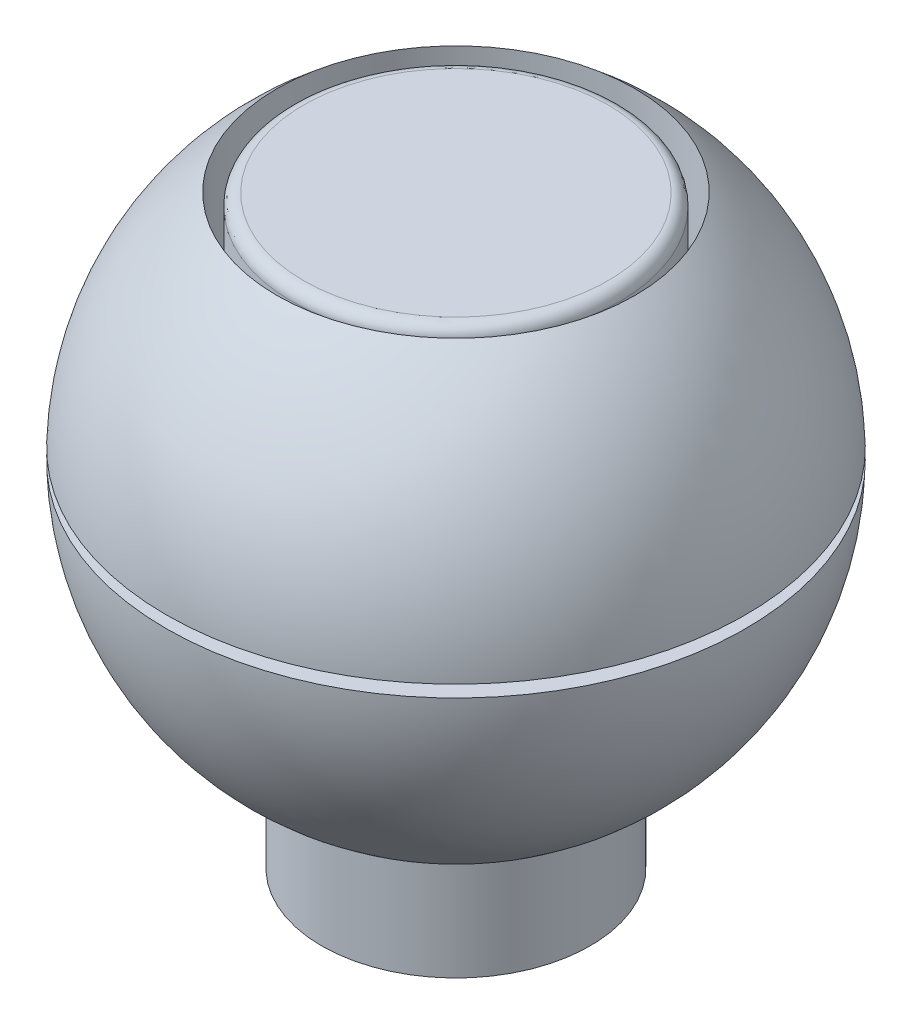
ISO-10303-21;
HEADER;
FILE_DESCRIPTION(('STEP AP214'),'2;1');
FILE_NAME('part.step','',(''),(''),'','','');
FILE_SCHEMA(('AUTOMOTIVE_DESIGN { 1 0 10303 214 1 1 1 1 }'));
ENDSEC;
DATA;
#1=APPLICATION_CONTEXT('core data for automotive mechanical design processes');
#2=APPLICATION_PROTOCOL_DEFINITION('international standard','automotive_design',2000,#1);
#3=PRODUCT_CONTEXT('',#1,'mechanical');
#4=PRODUCT('Part','Part','',(#3));
#5=PRODUCT_RELATED_PRODUCT_CATEGORY('part','',(#4));
#6=PRODUCT_DEFINITION_FORMATION('','',#4);
#7=PRODUCT_DEFINITION_CONTEXT('part definition',#1,'design');
#8=PRODUCT_DEFINITION('design','',#6,#7);
#9=PRODUCT_DEFINITION_SHAPE('','',#8);
#10=(LENGTH_UNIT() NAMED_UNIT(*) SI_UNIT(.MILLI.,.METRE.));
#11=(NAMED_UNIT(*) PLANE_ANGLE_UNIT() SI_UNIT($,.RADIAN.));
#12=(NAMED_UNIT(*) SI_UNIT($,.STERADIAN.) SOLID_ANGLE_UNIT());
#13=UNCERTAINTY_MEASURE_WITH_UNIT(LENGTH_MEASURE(1.E-05),#10,'distance_accuracy_value','');
#14=(GEOMETRIC_REPRESENTATION_CONTEXT(3) GLOBAL_UNCERTAINTY_ASSIGNED_CONTEXT((#13)) GLOBAL_UNIT_ASSIGNED_CONTEXT((#10,
#11,#12)) REPRESENTATION_CONTEXT('',''));
#15=CARTESIAN_POINT('',(0.,0.,0.));
#16=DIRECTION('',(0.,0.,1.));
#17=DIRECTION('',(1.,0.,0.));
#18=AXIS2_PLACEMENT_3D('',#15,#16,#17);
#19=CARTESIAN_POINT('',(0.,0.,0.));
#20=DIRECTION('',(0.,0.,1.));
#21=DIRECTION('',(-1.,0.,0.));
#22=AXIS2_PLACEMENT_3D('',#19,#20,#21);
#23=SPHERICAL_SURFACE('',#22,4.85);
#24=CARTESIAN_POINT('',(0.,0.,0.));
#25=DIRECTION('',(0.,1.,0.));
#26=DIRECTION('',(0.,0.,1.));
#27=AXIS2_PLACEMENT_3D('',#24,#25,#26);
#28=SPHERICAL_SURFACE('',#27,4.85);
#29=CARTESIAN_POINT('',(0.,-4.29651021178817,0.));
#30=DIRECTION('',(0.,1.,0.));
#31=DIRECTION('',(0.,0.,1.));
#32=AXIS2_PLACEMENT_3D('',#29,#30,#31);
#33=CIRCLE('',#32,2.25);
#34=CARTESIAN_POINT('',(0.,-4.29651021178817,2.25));
#35=VERTEX_POINT('',#34);
#36=EDGE_CURVE('E54',#35,#35,#33,.F.);
#37=ORIENTED_EDGE('',*,*,#36,.F.);
#38=EDGE_LOOP('',(#37));
#39=FACE_BOUND('',#38,.T.);
#40=CARTESIAN_POINT('',(0.,-0.1,0.));
#41=DIRECTION('',(0.,1.,0.));
#42=DIRECTION('',(0.,0.,1.));
#43=AXIS2_PLACEMENT_3D('',#40,#41,#42);
#44=CIRCLE('',#43,4.84896896257338);
#45=CARTESIAN_POINT('',(0.,-0.1,4.84896896257338));
#46=VERTEX_POINT('',#45);
#47=EDGE_CURVE('E46',#46,#46,#44,.F.);
#48=ORIENTED_EDGE('',*,*,#47,.T.);
#49=EDGE_LOOP('',(#48));
#50=FACE_BOUND('',#49,.T.);
#51=ADVANCED_FACE('F43',(#39,#50),#28,.T.);
#52=CARTESIAN_POINT('',(0.,10.,0.));
#53=DIRECTION('',(0.,-1.,0.));
#54=DIRECTION('',(0.,0.,-1.));
#55=AXIS2_PLACEMENT_3D('',#52,#53,#54);
#56=CYLINDRICAL_SURFACE('',#55,1.6);
#57=CARTESIAN_POINT('',(0.,-6.,0.));
#58=DIRECTION('',(0.,1.,0.));
#59=DIRECTION('',(0.,0.,1.));
#60=AXIS2_PLACEMENT_3D('',#57,#58,#59);
#61=CIRCLE('',#60,1.6);
#62=CARTESIAN_POINT('',(0.,-6.,1.6));
#63=VERTEX_POINT('',#62);
#64=EDGE_CURVE('E11',#63,#63,#61,.T.);
#65=ORIENTED_EDGE('',*,*,#64,.F.);
#66=EDGE_LOOP('',(#65));
#67=FACE_BOUND('',#66,.T.);
#68=CARTESIAN_POINT('',(0.,-0.0999999999999994,0.));
#69=DIRECTION('',(0.,1.,0.));
#70=DIRECTION('',(0.,0.,1.));
#71=AXIS2_PLACEMENT_3D('',#68,#69,#70);
#72=CIRCLE('',#71,1.6);
#73=CARTESIAN_POINT('',(0.,-0.0999999999999994,1.6));
#74=VERTEX_POINT('',#73);
#75=EDGE_CURVE('E59',#74,#74,#72,.T.);
#76=ORIENTED_EDGE('',*,*,#75,.T.);
#77=EDGE_LOOP('',(#76));
#78=FACE_BOUND('',#77,.T.);
#79=ADVANCED_FACE('F78',(#67,#78),#56,.F.);
#80=CARTESIAN_POINT('',(0.,-6.,0.));
#81=DIRECTION('',(0.,1.,0.));
#82=DIRECTION('',(0.,0.,1.));
#83=AXIS2_PLACEMENT_3D('',#80,#81,#82);
#84=CYLINDRICAL_SURFACE('',#83,2.25);
#85=ORIENTED_EDGE('',*,*,#36,.T.);
#86=EDGE_LOOP('',(#85));
#87=FACE_BOUND('',#86,.T.);
#88=CARTESIAN_POINT('',(0.,-6.,0.));
#89=DIRECTION('',(0.,1.,0.));
#90=DIRECTION('',(0.,0.,1.));
#91=AXIS2_PLACEMENT_3D('',#88,#89,#90);
#92=CIRCLE('',#91,2.25);
#93=CARTESIAN_POINT('',(0.,-6.,2.25));
#94=VERTEX_POINT('',#93);
#95=EDGE_CURVE('E50',#94,#94,#92,.T.);
#96=ORIENTED_EDGE('',*,*,#95,.T.);
#97=EDGE_LOOP('',(#96));
#98=FACE_BOUND('',#97,.T.);
#99=ADVANCED_FACE('F75',(#87,#98),#84,.T.);
#100=CARTESIAN_POINT('',(0.,-6.,0.));
#101=DIRECTION('',(0.,1.,0.));
#102=DIRECTION('',(0.,0.,1.));
#103=AXIS2_PLACEMENT_3D('',#100,#101,#102);
#104=PLANE('',#103);
#105=ORIENTED_EDGE('',*,*,#64,.T.);
#106=EDGE_LOOP('',(#105));
#107=FACE_BOUND('',#106,.T.);
#108=ORIENTED_EDGE('',*,*,#95,.F.);
#109=EDGE_LOOP('',(#108));
#110=FACE_BOUND('',#109,.T.);
#111=ADVANCED_FACE('F70',(#107,#110),#104,.F.);
#112=CARTESIAN_POINT('',(0.,-0.1,0.));
#113=DIRECTION('',(0.,1.,0.));
#114=DIRECTION('',(0.,0.,1.));
#115=AXIS2_PLACEMENT_3D('',#112,#113,#114);
#116=PLANE('',#115);
#117=ORIENTED_EDGE('',*,*,#47,.F.);
#118=EDGE_LOOP('',(#117));
#119=FACE_BOUND('',#118,.T.);
#120=ORIENTED_EDGE('',*,*,#75,.F.);
#121=EDGE_LOOP('',(#120));
#122=FACE_BOUND('',#121,.T.);
#123=ADVANCED_FACE('F67',(#119,#122),#116,.T.);
#124=CLOSED_SHELL('',(#51,#79,#99,#111,#123));
#125=MANIFOLD_SOLID_BREP('B2',#124);
#126=CARTESIAN_POINT('',(0.,3.8,0.));
#127=DIRECTION('',(0.,-1.,0.));
#128=DIRECTION('',(0.,0.,-1.));
#129=AXIS2_PLACEMENT_3D('',#126,#127,#128);
#130=CYLINDRICAL_SURFACE('',#129,2.75);
#131=CARTESIAN_POINT('',(0.,3.6,0.));
#132=DIRECTION('',(0.,1.,0.));
#133=DIRECTION('',(0.,0.,1.));
#134=AXIS2_PLACEMENT_3D('',#131,#132,#133);
#135=CIRCLE('',#134,2.75);
#136=CARTESIAN_POINT('',(0.,3.6,2.75));
#137=VERTEX_POINT('',#136);
#138=EDGE_CURVE('E42',#137,#137,#135,.F.);
#139=ORIENTED_EDGE('',*,*,#138,.T.);
#140=EDGE_LOOP('',(#139));
#141=FACE_BOUND('',#140,.T.);
#142=CARTESIAN_POINT('',(0.,0.8,0.));
#143=DIRECTION('',(0.,1.,0.));
#144=DIRECTION('',(0.,0.,1.));
#145=AXIS2_PLACEMENT_3D('',#142,#143,#144);
#146=CIRCLE('',#145,2.75);
#147=CARTESIAN_POINT('',(0.,0.8,2.75));
#148=VERTEX_POINT('',#147);
#149=EDGE_CURVE('E140',#148,#148,#146,.T.);
#150=ORIENTED_EDGE('',*,*,#149,.T.);
#151=EDGE_LOOP('',(#150));
#152=FACE_BOUND('',#151,.T.);
#153=ADVANCED_FACE('F129',(#141,#152),#130,.T.);
#154=CARTESIAN_POINT('',(0.,3.8,0.));
#155=DIRECTION('',(0.,1.,0.));
#156=DIRECTION('',(0.,0.,1.));
#157=AXIS2_PLACEMENT_3D('',#154,#155,#156);
#158=PLANE('',#157);
#159=CARTESIAN_POINT('',(0.,3.8,0.));
#160=DIRECTION('',(0.,1.,0.));
#161=DIRECTION('',(0.,0.,1.));
#162=AXIS2_PLACEMENT_3D('',#159,#160,#161);
#163=CIRCLE('',#162,2.55);
#164=CARTESIAN_POINT('',(0.,3.8,2.55));
#165=VERTEX_POINT('',#164);
#166=EDGE_CURVE('E136',#165,#165,#163,.T.);
#167=ORIENTED_EDGE('',*,*,#166,.T.);
#168=EDGE_LOOP('',(#167));
#169=FACE_BOUND('',#168,.T.);
#170=ADVANCED_FACE('F150',(#169),#158,.T.);
#171=CARTESIAN_POINT('',(0.,0.8,0.));
#172=DIRECTION('',(0.,1.,0.));
#173=DIRECTION('',(0.,0.,1.));
#174=AXIS2_PLACEMENT_3D('',#171,#172,#173);
#175=PLANE('',#174);
#176=ORIENTED_EDGE('',*,*,#149,.F.);
#177=EDGE_LOOP('',(#176));
#178=FACE_BOUND('',#177,.T.);
#179=ADVANCED_FACE('F148',(#178),#175,.F.);
#180=CARTESIAN_POINT('',(0.,3.6,0.));
#181=DIRECTION('',(0.,1.,0.));
#182=DIRECTION('',(0.,0.,1.));
#183=AXIS2_PLACEMENT_3D('',#180,#181,#182);
#184=TOROIDAL_SURFACE('',#183,2.55,0.2);
#185=ORIENTED_EDGE('',*,*,#138,.F.);
#186=EDGE_LOOP('',(#185));
#187=FACE_BOUND('',#186,.T.);
#188=ORIENTED_EDGE('',*,*,#166,.F.);
#189=EDGE_LOOP('',(#188));
#190=FACE_BOUND('',#189,.T.);
#191=ADVANCED_FACE('F131',(#187,#190),#184,.T.);
#192=CLOSED_SHELL('',(#153,#170,#179,#191));
#193=MANIFOLD_SOLID_BREP('B6',#192);
#194=CARTESIAN_POINT('',(0.,0.8,0.));
#195=DIRECTION('',(0.,1.,0.));
#196=DIRECTION('',(0.,0.,1.));
#197=AXIS2_PLACEMENT_3D('',#194,#195,#196);
#198=PLANE('',#197);
#199=CARTESIAN_POINT('',(0.,0.8,0.));
#200=DIRECTION('',(0.,1.,0.));
#201=DIRECTION('',(0.,0.,1.));
#202=AXIS2_PLACEMENT_3D('',#199,#200,#201);
#203=CIRCLE('',#202,1.6);
#204=CARTESIAN_POINT('',(0.,0.8,1.6));
#205=VERTEX_POINT('',#204);
#206=EDGE_CURVE('E192',#205,#205,#203,.T.);
#207=ORIENTED_EDGE('',*,*,#206,.F.);
#208=EDGE_LOOP('',(#207));
#209=FACE_BOUND('',#208,.T.);
#210=CARTESIAN_POINT('',(0.,0.8,0.));
#211=DIRECTION('',(0.,1.,0.));
#212=DIRECTION('',(0.,0.,1.));
#213=AXIS2_PLACEMENT_3D('',#210,#211,#212);
#214=CIRCLE('',#213,3.);
#215=CARTESIAN_POINT('',(0.,0.8,3.));
#216=VERTEX_POINT('',#215);
#217=EDGE_CURVE('E196',#216,#216,#214,.T.);
#218=ORIENTED_EDGE('',*,*,#217,.T.);
#219=EDGE_LOOP('',(#218));
#220=FACE_BOUND('',#219,.T.);
#221=ADVANCED_FACE('F184',(#209,#220),#198,.T.);
#222=CARTESIAN_POINT('',(0.,10.,0.));
#223=DIRECTION('',(0.,-1.,0.));
#224=DIRECTION('',(0.,0.,-1.));
#225=AXIS2_PLACEMENT_3D('',#222,#223,#224);
#226=CYLINDRICAL_SURFACE('',#225,1.6);
#227=CARTESIAN_POINT('',(0.,0.0999999999999994,0.));
#228=DIRECTION('',(0.,1.,0.));
#229=DIRECTION('',(0.,0.,1.));
#230=AXIS2_PLACEMENT_3D('',#227,#228,#229);
#231=CIRCLE('',#230,1.6);
#232=CARTESIAN_POINT('',(0.,0.0999999999999994,1.6));
#233=VERTEX_POINT('',#232);
#234=EDGE_CURVE('E188',#233,#233,#231,.T.);
#235=ORIENTED_EDGE('',*,*,#234,.F.);
#236=EDGE_LOOP('',(#235));
#237=FACE_BOUND('',#236,.T.);
#238=ORIENTED_EDGE('',*,*,#206,.T.);
#239=EDGE_LOOP('',(#238));
#240=FACE_BOUND('',#239,.T.);
#241=ADVANCED_FACE('F210',(#237,#240),#226,.F.);
#242=CARTESIAN_POINT('',(0.,10.8,0.));
#243=DIRECTION('',(0.,-1.,0.));
#244=DIRECTION('',(0.,0.,-1.));
#245=AXIS2_PLACEMENT_3D('',#242,#243,#244);
#246=CYLINDRICAL_SURFACE('',#245,3.);
#247=CARTESIAN_POINT('',(0.,3.81083980245825,0.));
#248=DIRECTION('',(0.,-1.,0.));
#249=DIRECTION('',(0.,0.,-1.));
#250=AXIS2_PLACEMENT_3D('',#247,#248,#249);
#251=CIRCLE('',#250,3.);
#252=CARTESIAN_POINT('',(0.,3.81083980245825,-3.));
#253=VERTEX_POINT('',#252);
#254=EDGE_CURVE('E128',#253,#253,#251,.T.);
#255=ORIENTED_EDGE('',*,*,#254,.F.);
#256=EDGE_LOOP('',(#255));
#257=FACE_BOUND('',#256,.T.);
#258=ORIENTED_EDGE('',*,*,#217,.F.);
#259=EDGE_LOOP('',(#258));
#260=FACE_BOUND('',#259,.T.);
#261=ADVANCED_FACE('F213',(#257,#260),#246,.F.);
#262=CARTESIAN_POINT('',(0.,0.,0.));
#263=DIRECTION('',(0.,0.,1.));
#264=DIRECTION('',(-1.,0.,0.));
#265=AXIS2_PLACEMENT_3D('',#262,#263,#264);
#266=SPHERICAL_SURFACE('',#265,4.85);
#267=CARTESIAN_POINT('',(0.,0.,0.));
#268=DIRECTION('',(0.,1.,0.));
#269=DIRECTION('',(0.,0.,1.));
#270=AXIS2_PLACEMENT_3D('',#267,#268,#269);
#271=SPHERICAL_SURFACE('',#270,4.85);
#272=CARTESIAN_POINT('',(0.,0.1,0.));
#273=DIRECTION('',(0.,1.,0.));
#274=DIRECTION('',(0.,0.,1.));
#275=AXIS2_PLACEMENT_3D('',#272,#273,#274);
#276=CIRCLE('',#275,4.84896896257338);
#277=CARTESIAN_POINT('',(0.,0.1,4.84896896257338));
#278=VERTEX_POINT('',#277);
#279=EDGE_CURVE('E201',#278,#278,#276,.F.);
#280=ORIENTED_EDGE('',*,*,#279,.F.);
#281=EDGE_LOOP('',(#280));
#282=FACE_BOUND('',#281,.T.);
#283=ORIENTED_EDGE('',*,*,#254,.T.);
#284=EDGE_LOOP('',(#283));
#285=FACE_BOUND('',#284,.T.);
#286=ADVANCED_FACE('F186',(#282,#285),#271,.T.);
#287=CARTESIAN_POINT('',(0.,0.1,0.));
#288=DIRECTION('',(0.,1.,0.));
#289=DIRECTION('',(0.,0.,1.));
#290=AXIS2_PLACEMENT_3D('',#287,#288,#289);
#291=PLANE('',#290);
#292=ORIENTED_EDGE('',*,*,#279,.T.);
#293=EDGE_LOOP('',(#292));
#294=FACE_BOUND('',#293,.T.);
#295=ORIENTED_EDGE('',*,*,#234,.T.);
#296=EDGE_LOOP('',(#295));
#297=FACE_BOUND('',#296,.T.);
#298=ADVANCED_FACE('F208',(#294,#297),#291,.F.);
#299=CLOSED_SHELL('',(#221,#241,#261,#286,#298));
#300=MANIFOLD_SOLID_BREP('B37',#299);
#301=ADVANCED_BREP_SHAPE_REPRESENTATION('',(#18,#125,#193,#300),#14);
#302=SHAPE_DEFINITION_REPRESENTATION(#9,#301);
ENDSEC;
END-ISO-10303-21;
